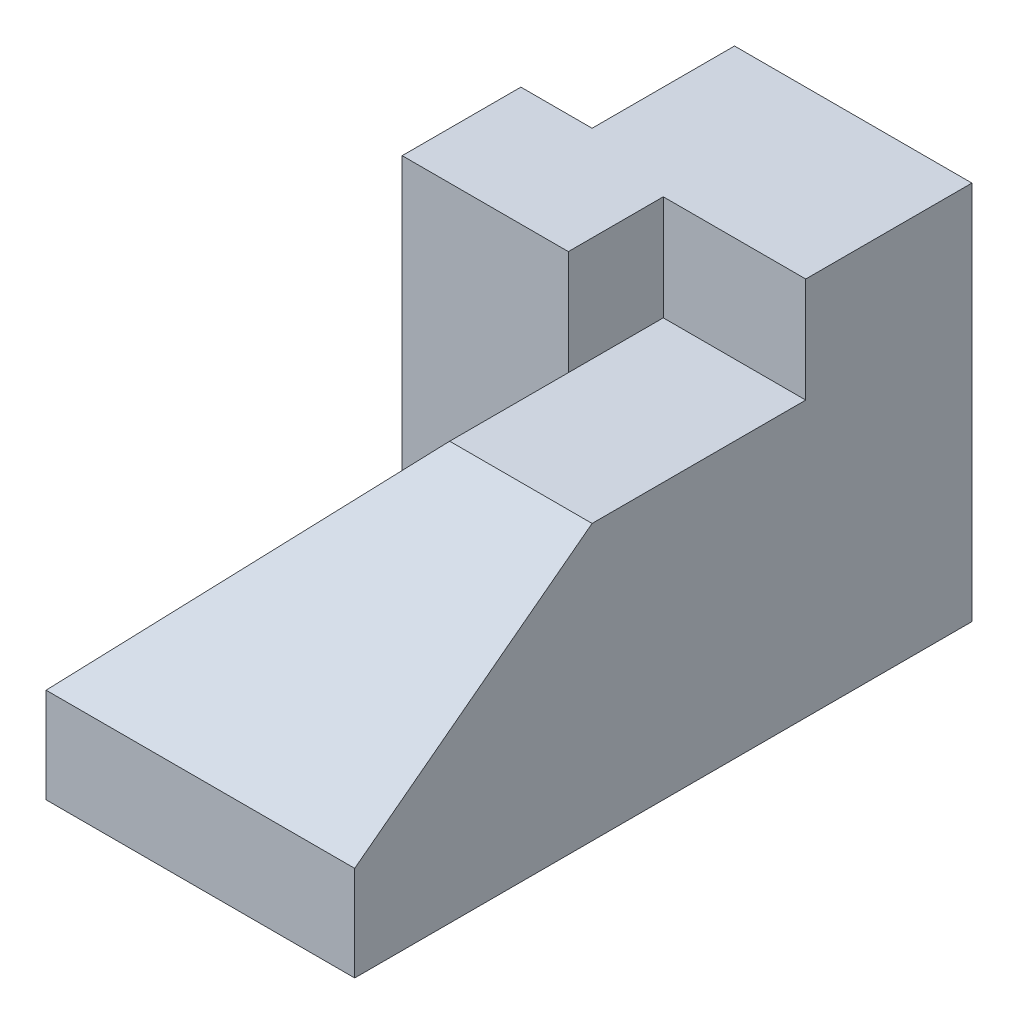
ISO-10303-21;
HEADER;
FILE_DESCRIPTION(('STEP AP214'),'2;1');
FILE_NAME('part.step','',(''),(''),'','','');
FILE_SCHEMA(('AUTOMOTIVE_DESIGN { 1 0 10303 214 1 1 1 1 }'));
ENDSEC;
DATA;
#1=APPLICATION_CONTEXT('core data for automotive mechanical design processes');
#2=APPLICATION_PROTOCOL_DEFINITION('international standard','automotive_design',2000,#1);
#3=PRODUCT_CONTEXT('',#1,'mechanical');
#4=PRODUCT('Part','Part','',(#3));
#5=PRODUCT_RELATED_PRODUCT_CATEGORY('part','',(#4));
#6=PRODUCT_DEFINITION_FORMATION('','',#4);
#7=PRODUCT_DEFINITION_CONTEXT('part definition',#1,'design');
#8=PRODUCT_DEFINITION('design','',#6,#7);
#9=PRODUCT_DEFINITION_SHAPE('','',#8);
#10=(LENGTH_UNIT() NAMED_UNIT(*) SI_UNIT(.MILLI.,.METRE.));
#11=(NAMED_UNIT(*) PLANE_ANGLE_UNIT() SI_UNIT($,.RADIAN.));
#12=(NAMED_UNIT(*) SI_UNIT($,.STERADIAN.) SOLID_ANGLE_UNIT());
#13=UNCERTAINTY_MEASURE_WITH_UNIT(LENGTH_MEASURE(1.E-05),#10,'distance_accuracy_value','');
#14=(GEOMETRIC_REPRESENTATION_CONTEXT(3) GLOBAL_UNCERTAINTY_ASSIGNED_CONTEXT((#13)) GLOBAL_UNIT_ASSIGNED_CONTEXT((#10,
#11,#12)) REPRESENTATION_CONTEXT('',''));
#15=CARTESIAN_POINT('',(0.,0.,0.));
#16=DIRECTION('',(0.,0.,1.));
#17=DIRECTION('',(1.,0.,0.));
#18=AXIS2_PLACEMENT_3D('',#15,#16,#17);
#19=CARTESIAN_POINT('',(0.,80.,-75.));
#20=DIRECTION('',(0.,0.,-1.));
#21=DIRECTION('',(-1.,0.,0.));
#22=AXIS2_PLACEMENT_3D('',#19,#20,#21);
#23=PLANE('',#22);
#24=DIRECTION('',(-0.678309305318936,-0.734776487319608,0.));
#25=VECTOR('',#24,1.);
#26=CARTESIAN_POINT('',(0.,20.,-75.));
#27=LINE('',#26,#25);
#28=CARTESIAN_POINT('',(35.,57.9136433106933,-75.));
#29=VERTEX_POINT('',#28);
#30=CARTESIAN_POINT('',(0.,20.,-75.));
#31=VERTEX_POINT('',#30);
#32=EDGE_CURVE('E131',#29,#31,#27,.T.);
#33=ORIENTED_EDGE('',*,*,#32,.F.);
#34=DIRECTION('',(0.,-1.,0.));
#35=VECTOR('',#34,1.);
#36=CARTESIAN_POINT('',(35.,80.,-75.));
#37=LINE('',#36,#35);
#38=CARTESIAN_POINT('',(35.,80.,-75.));
#39=VERTEX_POINT('',#38);
#40=EDGE_CURVE('E184',#39,#29,#37,.T.);
#41=ORIENTED_EDGE('',*,*,#40,.F.);
#42=DIRECTION('',(1.,0.,0.));
#43=VECTOR('',#42,1.);
#44=CARTESIAN_POINT('',(0.,80.,-75.));
#45=LINE('',#44,#43);
#46=CARTESIAN_POINT('',(0.,80.,-75.));
#47=VERTEX_POINT('',#46);
#48=EDGE_CURVE('E215',#47,#39,#45,.T.);
#49=ORIENTED_EDGE('',*,*,#48,.F.);
#50=DIRECTION('',(0.,-1.,0.));
#51=VECTOR('',#50,1.);
#52=CARTESIAN_POINT('',(0.,80.,-75.));
#53=LINE('',#52,#51);
#54=EDGE_CURVE('E187',#47,#31,#53,.T.);
#55=ORIENTED_EDGE('',*,*,#54,.T.);
#56=EDGE_LOOP('',(#33,#41,#49,#55));
#57=FACE_BOUND('',#56,.T.);
#58=ADVANCED_FACE('F39',(#57),#23,.F.);
#59=CARTESIAN_POINT('',(0.,20.,0.));
#60=DIRECTION('',(-1.,0.,0.));
#61=DIRECTION('',(0.,0.,1.));
#62=AXIS2_PLACEMENT_3D('',#59,#60,#61);
#63=PLANE('',#62);
#64=DIRECTION('',(0.,0.,-1.));
#65=VECTOR('',#64,1.);
#66=CARTESIAN_POINT('',(0.,0.,0.));
#67=LINE('',#66,#65);
#68=CARTESIAN_POINT('',(0.,0.,0.));
#69=VERTEX_POINT('',#68);
#70=CARTESIAN_POINT('',(0.,0.,-100.));
#71=VERTEX_POINT('',#70);
#72=EDGE_CURVE('E143',#69,#71,#67,.T.);
#73=ORIENTED_EDGE('',*,*,#72,.F.);
#74=DIRECTION('',(0.,-1.,0.));
#75=VECTOR('',#74,1.);
#76=CARTESIAN_POINT('',(0.,20.,0.));
#77=LINE('',#76,#75);
#78=CARTESIAN_POINT('',(0.,20.,0.));
#79=VERTEX_POINT('',#78);
#80=EDGE_CURVE('E11',#79,#69,#77,.T.);
#81=ORIENTED_EDGE('',*,*,#80,.F.);
#82=DIRECTION('',(0.,0.,-1.));
#83=VECTOR('',#82,1.);
#84=CARTESIAN_POINT('',(0.,20.,0.));
#85=LINE('',#84,#83);
#86=EDGE_CURVE('E134',#79,#31,#85,.T.);
#87=ORIENTED_EDGE('',*,*,#86,.T.);
#88=ORIENTED_EDGE('',*,*,#54,.F.);
#89=DIRECTION('',(0.,0.,-1.));
#90=VECTOR('',#89,1.);
#91=CARTESIAN_POINT('',(0.,80.,0.));
#92=LINE('',#91,#90);
#93=CARTESIAN_POINT('',(0.,80.,-100.));
#94=VERTEX_POINT('',#93);
#95=EDGE_CURVE('E213',#47,#94,#92,.T.);
#96=ORIENTED_EDGE('',*,*,#95,.T.);
#97=DIRECTION('',(0.,-1.,0.));
#98=VECTOR('',#97,1.);
#99=CARTESIAN_POINT('',(0.,80.,-100.));
#100=LINE('',#99,#98);
#101=EDGE_CURVE('E145',#94,#71,#100,.T.);
#102=ORIENTED_EDGE('',*,*,#101,.T.);
#103=EDGE_LOOP('',(#73,#81,#87,#88,#96,#102));
#104=FACE_BOUND('',#103,.T.);
#105=ADVANCED_FACE('F41',(#104),#63,.T.);
#106=CARTESIAN_POINT('',(0.,20.,0.));
#107=DIRECTION('',(0.,0.,-1.));
#108=DIRECTION('',(-1.,0.,0.));
#109=AXIS2_PLACEMENT_3D('',#106,#107,#108);
#110=PLANE('',#109);
#111=DIRECTION('',(1.,0.,0.));
#112=VECTOR('',#111,1.);
#113=CARTESIAN_POINT('',(35.,20.,0.));
#114=LINE('',#113,#112);
#115=CARTESIAN_POINT('',(65.,20.,0.));
#116=VERTEX_POINT('',#115);
#117=EDGE_CURVE('E116',#79,#116,#114,.T.);
#118=ORIENTED_EDGE('',*,*,#117,.F.);
#119=ORIENTED_EDGE('',*,*,#80,.T.);
#120=DIRECTION('',(1.,0.,0.));
#121=VECTOR('',#120,1.);
#122=CARTESIAN_POINT('',(0.,0.,0.));
#123=LINE('',#122,#121);
#124=CARTESIAN_POINT('',(65.,0.,0.));
#125=VERTEX_POINT('',#124);
#126=EDGE_CURVE('E53',#69,#125,#123,.T.);
#127=ORIENTED_EDGE('',*,*,#126,.T.);
#128=DIRECTION('',(0.,-1.,0.));
#129=VECTOR('',#128,1.);
#130=CARTESIAN_POINT('',(65.,20.,0.));
#131=LINE('',#130,#129);
#132=EDGE_CURVE('E47',#116,#125,#131,.T.);
#133=ORIENTED_EDGE('',*,*,#132,.F.);
#134=EDGE_LOOP('',(#118,#119,#127,#133));
#135=FACE_BOUND('',#134,.T.);
#136=ADVANCED_FACE('F118',(#135),#110,.F.);
#137=CARTESIAN_POINT('',(65.,20.,0.));
#138=DIRECTION('',(-1.,0.,0.));
#139=DIRECTION('',(0.,0.,1.));
#140=AXIS2_PLACEMENT_3D('',#137,#138,#139);
#141=PLANE('',#140);
#142=DIRECTION('',(0.,0.,-1.));
#143=VECTOR('',#142,1.);
#144=CARTESIAN_POINT('',(65.,0.,0.));
#145=LINE('',#144,#143);
#146=CARTESIAN_POINT('',(65.,0.,-130.));
#147=VERTEX_POINT('',#146);
#148=EDGE_CURVE('E139',#125,#147,#145,.T.);
#149=ORIENTED_EDGE('',*,*,#148,.T.);
#150=DIRECTION('',(0.,-1.,0.));
#151=VECTOR('',#150,1.);
#152=CARTESIAN_POINT('',(65.,80.,-130.));
#153=LINE('',#152,#151);
#154=CARTESIAN_POINT('',(65.,80.,-130.));
#155=VERTEX_POINT('',#154);
#156=EDGE_CURVE('E149',#155,#147,#153,.T.);
#157=ORIENTED_EDGE('',*,*,#156,.F.);
#158=DIRECTION('',(0.,0.,-1.));
#159=VECTOR('',#158,1.);
#160=CARTESIAN_POINT('',(65.,80.,0.));
#161=LINE('',#160,#159);
#162=CARTESIAN_POINT('',(65.,80.,-95.));
#163=VERTEX_POINT('',#162);
#164=EDGE_CURVE('E177',#163,#155,#161,.T.);
#165=ORIENTED_EDGE('',*,*,#164,.F.);
#166=DIRECTION('',(0.,-1.,0.));
#167=VECTOR('',#166,1.);
#168=CARTESIAN_POINT('',(65.,80.,-95.));
#169=LINE('',#168,#167);
#170=CARTESIAN_POINT('',(65.,57.9136433106933,-95.));
#171=VERTEX_POINT('',#170);
#172=EDGE_CURVE('E178',#163,#171,#169,.T.);
#173=ORIENTED_EDGE('',*,*,#172,.T.);
#174=DIRECTION('',(0.,0.,1.));
#175=VECTOR('',#174,1.);
#176=CARTESIAN_POINT('',(65.,57.9136433106933,-95.));
#177=LINE('',#176,#175);
#178=CARTESIAN_POINT('',(65.,57.9136433106933,-50.));
#179=VERTEX_POINT('',#178);
#180=EDGE_CURVE('E225',#171,#179,#177,.T.);
#181=ORIENTED_EDGE('',*,*,#180,.T.);
#182=DIRECTION('',(0.,-0.604210552093307,0.796824703896096));
#183=VECTOR('',#182,1.);
#184=CARTESIAN_POINT('',(65.,57.9136433106933,-50.));
#185=LINE('',#184,#183);
#186=EDGE_CURVE('E161',#179,#116,#185,.T.);
#187=ORIENTED_EDGE('',*,*,#186,.T.);
#188=ORIENTED_EDGE('',*,*,#132,.T.);
#189=EDGE_LOOP('',(#149,#157,#165,#173,#181,#187,#188));
#190=FACE_BOUND('',#189,.T.);
#191=ADVANCED_FACE('F158',(#190),#141,.F.);
#192=CARTESIAN_POINT('',(0.,0.,0.));
#193=DIRECTION('',(0.,1.,0.));
#194=DIRECTION('',(0.,0.,1.));
#195=AXIS2_PLACEMENT_3D('',#192,#193,#194);
#196=PLANE('',#195);
#197=ORIENTED_EDGE('',*,*,#72,.T.);
#198=DIRECTION('',(1.,0.,0.));
#199=VECTOR('',#198,1.);
#200=CARTESIAN_POINT('',(0.,0.,-100.));
#201=LINE('',#200,#199);
#202=CARTESIAN_POINT('',(15.,0.,-100.));
#203=VERTEX_POINT('',#202);
#204=EDGE_CURVE('E170',#71,#203,#201,.T.);
#205=ORIENTED_EDGE('',*,*,#204,.T.);
#206=DIRECTION('',(0.,0.,-1.));
#207=VECTOR('',#206,1.);
#208=CARTESIAN_POINT('',(15.,0.,0.));
#209=LINE('',#208,#207);
#210=CARTESIAN_POINT('',(15.,0.,-130.));
#211=VERTEX_POINT('',#210);
#212=EDGE_CURVE('E167',#203,#211,#209,.T.);
#213=ORIENTED_EDGE('',*,*,#212,.T.);
#214=DIRECTION('',(1.,0.,0.));
#215=VECTOR('',#214,1.);
#216=CARTESIAN_POINT('',(0.,0.,-130.));
#217=LINE('',#216,#215);
#218=EDGE_CURVE('E122',#211,#147,#217,.T.);
#219=ORIENTED_EDGE('',*,*,#218,.T.);
#220=ORIENTED_EDGE('',*,*,#148,.F.);
#221=ORIENTED_EDGE('',*,*,#126,.F.);
#222=EDGE_LOOP('',(#197,#205,#213,#219,#220,#221));
#223=FACE_BOUND('',#222,.T.);
#224=ADVANCED_FACE('F163',(#223),#196,.F.);
#225=CARTESIAN_POINT('',(0.,80.,-130.));
#226=DIRECTION('',(0.,0.,-1.));
#227=DIRECTION('',(-1.,0.,0.));
#228=AXIS2_PLACEMENT_3D('',#225,#226,#227);
#229=PLANE('',#228);
#230=ORIENTED_EDGE('',*,*,#218,.F.);
#231=DIRECTION('',(0.,-1.,0.));
#232=VECTOR('',#231,1.);
#233=CARTESIAN_POINT('',(15.,80.,-130.));
#234=LINE('',#233,#232);
#235=CARTESIAN_POINT('',(15.,80.,-130.));
#236=VERTEX_POINT('',#235);
#237=EDGE_CURVE('E153',#236,#211,#234,.T.);
#238=ORIENTED_EDGE('',*,*,#237,.F.);
#239=DIRECTION('',(1.,0.,0.));
#240=VECTOR('',#239,1.);
#241=CARTESIAN_POINT('',(0.,80.,-130.));
#242=LINE('',#241,#240);
#243=EDGE_CURVE('E200',#236,#155,#242,.T.);
#244=ORIENTED_EDGE('',*,*,#243,.T.);
#245=ORIENTED_EDGE('',*,*,#156,.T.);
#246=EDGE_LOOP('',(#230,#238,#244,#245));
#247=FACE_BOUND('',#246,.T.);
#248=ADVANCED_FACE('F199',(#247),#229,.T.);
#249=CARTESIAN_POINT('',(15.,80.,0.));
#250=DIRECTION('',(-1.,0.,0.));
#251=DIRECTION('',(0.,0.,1.));
#252=AXIS2_PLACEMENT_3D('',#249,#250,#251);
#253=PLANE('',#252);
#254=ORIENTED_EDGE('',*,*,#212,.F.);
#255=DIRECTION('',(0.,-1.,0.));
#256=VECTOR('',#255,1.);
#257=CARTESIAN_POINT('',(15.,80.,-100.));
#258=LINE('',#257,#256);
#259=CARTESIAN_POINT('',(15.,80.,-100.));
#260=VERTEX_POINT('',#259);
#261=EDGE_CURVE('E190',#260,#203,#258,.T.);
#262=ORIENTED_EDGE('',*,*,#261,.F.);
#263=DIRECTION('',(0.,0.,-1.));
#264=VECTOR('',#263,1.);
#265=CARTESIAN_POINT('',(15.,80.,0.));
#266=LINE('',#265,#264);
#267=EDGE_CURVE('E196',#260,#236,#266,.T.);
#268=ORIENTED_EDGE('',*,*,#267,.T.);
#269=ORIENTED_EDGE('',*,*,#237,.T.);
#270=EDGE_LOOP('',(#254,#262,#268,#269));
#271=FACE_BOUND('',#270,.T.);
#272=ADVANCED_FACE('F194',(#271),#253,.T.);
#273=CARTESIAN_POINT('',(0.,80.,-100.));
#274=DIRECTION('',(0.,0.,-1.));
#275=DIRECTION('',(-1.,0.,0.));
#276=AXIS2_PLACEMENT_3D('',#273,#274,#275);
#277=PLANE('',#276);
#278=ORIENTED_EDGE('',*,*,#204,.F.);
#279=ORIENTED_EDGE('',*,*,#101,.F.);
#280=DIRECTION('',(1.,0.,0.));
#281=VECTOR('',#280,1.);
#282=CARTESIAN_POINT('',(0.,80.,-100.));
#283=LINE('',#282,#281);
#284=EDGE_CURVE('E207',#94,#260,#283,.T.);
#285=ORIENTED_EDGE('',*,*,#284,.T.);
#286=ORIENTED_EDGE('',*,*,#261,.T.);
#287=EDGE_LOOP('',(#278,#279,#285,#286));
#288=FACE_BOUND('',#287,.T.);
#289=ADVANCED_FACE('F242',(#288),#277,.T.);
#290=CARTESIAN_POINT('',(35.,80.,0.));
#291=DIRECTION('',(-1.,0.,0.));
#292=DIRECTION('',(0.,0.,1.));
#293=AXIS2_PLACEMENT_3D('',#290,#291,#292);
#294=PLANE('',#293);
#295=ORIENTED_EDGE('',*,*,#40,.T.);
#296=DIRECTION('',(0.,0.,1.));
#297=VECTOR('',#296,1.);
#298=CARTESIAN_POINT('',(35.,57.9136433106933,-95.));
#299=LINE('',#298,#297);
#300=CARTESIAN_POINT('',(35.,57.9136433106933,-95.));
#301=VERTEX_POINT('',#300);
#302=EDGE_CURVE('E232',#301,#29,#299,.T.);
#303=ORIENTED_EDGE('',*,*,#302,.F.);
#304=DIRECTION('',(0.,-1.,0.));
#305=VECTOR('',#304,1.);
#306=CARTESIAN_POINT('',(35.,80.,-95.));
#307=LINE('',#306,#305);
#308=CARTESIAN_POINT('',(35.,80.,-95.));
#309=VERTEX_POINT('',#308);
#310=EDGE_CURVE('E181',#309,#301,#307,.T.);
#311=ORIENTED_EDGE('',*,*,#310,.F.);
#312=DIRECTION('',(0.,0.,-1.));
#313=VECTOR('',#312,1.);
#314=CARTESIAN_POINT('',(35.,80.,0.));
#315=LINE('',#314,#313);
#316=EDGE_CURVE('E216',#39,#309,#315,.T.);
#317=ORIENTED_EDGE('',*,*,#316,.F.);
#318=EDGE_LOOP('',(#295,#303,#311,#317));
#319=FACE_BOUND('',#318,.T.);
#320=ADVANCED_FACE('F244',(#319),#294,.F.);
#321=CARTESIAN_POINT('',(0.,80.,-95.));
#322=DIRECTION('',(0.,0.,-1.));
#323=DIRECTION('',(-1.,0.,0.));
#324=AXIS2_PLACEMENT_3D('',#321,#322,#323);
#325=PLANE('',#324);
#326=ORIENTED_EDGE('',*,*,#310,.T.);
#327=DIRECTION('',(1.,0.,0.));
#328=VECTOR('',#327,1.);
#329=CARTESIAN_POINT('',(35.,57.9136433106933,-95.));
#330=LINE('',#329,#328);
#331=EDGE_CURVE('E224',#301,#171,#330,.T.);
#332=ORIENTED_EDGE('',*,*,#331,.T.);
#333=ORIENTED_EDGE('',*,*,#172,.F.);
#334=DIRECTION('',(1.,0.,0.));
#335=VECTOR('',#334,1.);
#336=CARTESIAN_POINT('',(0.,80.,-95.));
#337=LINE('',#336,#335);
#338=EDGE_CURVE('E173',#309,#163,#337,.T.);
#339=ORIENTED_EDGE('',*,*,#338,.F.);
#340=EDGE_LOOP('',(#326,#332,#333,#339));
#341=FACE_BOUND('',#340,.T.);
#342=ADVANCED_FACE('F223',(#341),#325,.F.);
#343=CARTESIAN_POINT('',(0.,80.,0.));
#344=DIRECTION('',(0.,1.,0.));
#345=DIRECTION('',(0.,0.,1.));
#346=AXIS2_PLACEMENT_3D('',#343,#344,#345);
#347=PLANE('',#346);
#348=ORIENTED_EDGE('',*,*,#164,.T.);
#349=ORIENTED_EDGE('',*,*,#243,.F.);
#350=ORIENTED_EDGE('',*,*,#267,.F.);
#351=ORIENTED_EDGE('',*,*,#284,.F.);
#352=ORIENTED_EDGE('',*,*,#95,.F.);
#353=ORIENTED_EDGE('',*,*,#48,.T.);
#354=ORIENTED_EDGE('',*,*,#316,.T.);
#355=ORIENTED_EDGE('',*,*,#338,.T.);
#356=EDGE_LOOP('',(#348,#349,#350,#351,#352,#353,#354,#355));
#357=FACE_BOUND('',#356,.T.);
#358=ADVANCED_FACE('F202',(#357),#347,.T.);
#359=CARTESIAN_POINT('',(35.,57.9136433106933,-50.));
#360=DIRECTION('',(0.,0.796824703896096,0.604210552093307));
#361=DIRECTION('',(0.,-0.604210552093307,0.796824703896096));
#362=AXIS2_PLACEMENT_3D('',#359,#360,#361);
#363=PLANE('',#362);
#364=ORIENTED_EDGE('',*,*,#186,.F.);
#365=DIRECTION('',(1.,0.,0.));
#366=VECTOR('',#365,1.);
#367=CARTESIAN_POINT('',(35.,57.9136433106933,-50.));
#368=LINE('',#367,#366);
#369=CARTESIAN_POINT('',(35.,57.9136433106933,-50.));
#370=VERTEX_POINT('',#369);
#371=EDGE_CURVE('E123',#370,#179,#368,.T.);
#372=ORIENTED_EDGE('',*,*,#371,.F.);
#373=DIRECTION('',(-0.487124926018229,-0.527676591222942,0.695892751454613));
#374=VECTOR('',#373,1.);
#375=CARTESIAN_POINT('',(26.6945884351172,48.9168315501369,-38.1351263358817));
#376=LINE('',#375,#374);
#377=EDGE_CURVE('E126',#370,#79,#376,.T.);
#378=ORIENTED_EDGE('',*,*,#377,.T.);
#379=ORIENTED_EDGE('',*,*,#117,.T.);
#380=EDGE_LOOP('',(#364,#372,#378,#379));
#381=FACE_BOUND('',#380,.T.);
#382=ADVANCED_FACE('F128',(#381),#363,.T.);
#383=CARTESIAN_POINT('',(35.,57.9136433106933,-95.));
#384=DIRECTION('',(0.,1.,0.));
#385=DIRECTION('',(0.,0.,1.));
#386=AXIS2_PLACEMENT_3D('',#383,#384,#385);
#387=PLANE('',#386);
#388=ORIENTED_EDGE('',*,*,#180,.F.);
#389=ORIENTED_EDGE('',*,*,#331,.F.);
#390=ORIENTED_EDGE('',*,*,#302,.T.);
#391=EDGE_CURVE('E228',#29,#370,#299,.T.);
#392=ORIENTED_EDGE('',*,*,#391,.T.);
#393=ORIENTED_EDGE('',*,*,#371,.T.);
#394=EDGE_LOOP('',(#388,#389,#390,#392,#393));
#395=FACE_BOUND('',#394,.T.);
#396=ADVANCED_FACE('F236',(#395),#387,.T.);
#397=CARTESIAN_POINT('',(0.,20.,0.));
#398=DIRECTION('',(0.734776487319608,-0.678309305318936,0.));
#399=DIRECTION('',(0.678309305318936,0.734776487319608,0.));
#400=AXIS2_PLACEMENT_3D('',#397,#398,#399);
#401=PLANE('',#400);
#402=ORIENTED_EDGE('',*,*,#86,.F.);
#403=ORIENTED_EDGE('',*,*,#377,.F.);
#404=ORIENTED_EDGE('',*,*,#391,.F.);
#405=ORIENTED_EDGE('',*,*,#32,.T.);
#406=EDGE_LOOP('',(#402,#403,#404,#405));
#407=FACE_BOUND('',#406,.T.);
#408=ADVANCED_FACE('F135',(#407),#401,.F.);
#409=CLOSED_SHELL('',(#58,#105,#136,#191,#224,#248,#272,#289,#320,#342,#358,#382,#396,#408));
#410=MANIFOLD_SOLID_BREP('B2',#409);
#411=ADVANCED_BREP_SHAPE_REPRESENTATION('',(#18,#410),#14);
#412=SHAPE_DEFINITION_REPRESENTATION(#9,#411);
ENDSEC;
END-ISO-10303-21;
